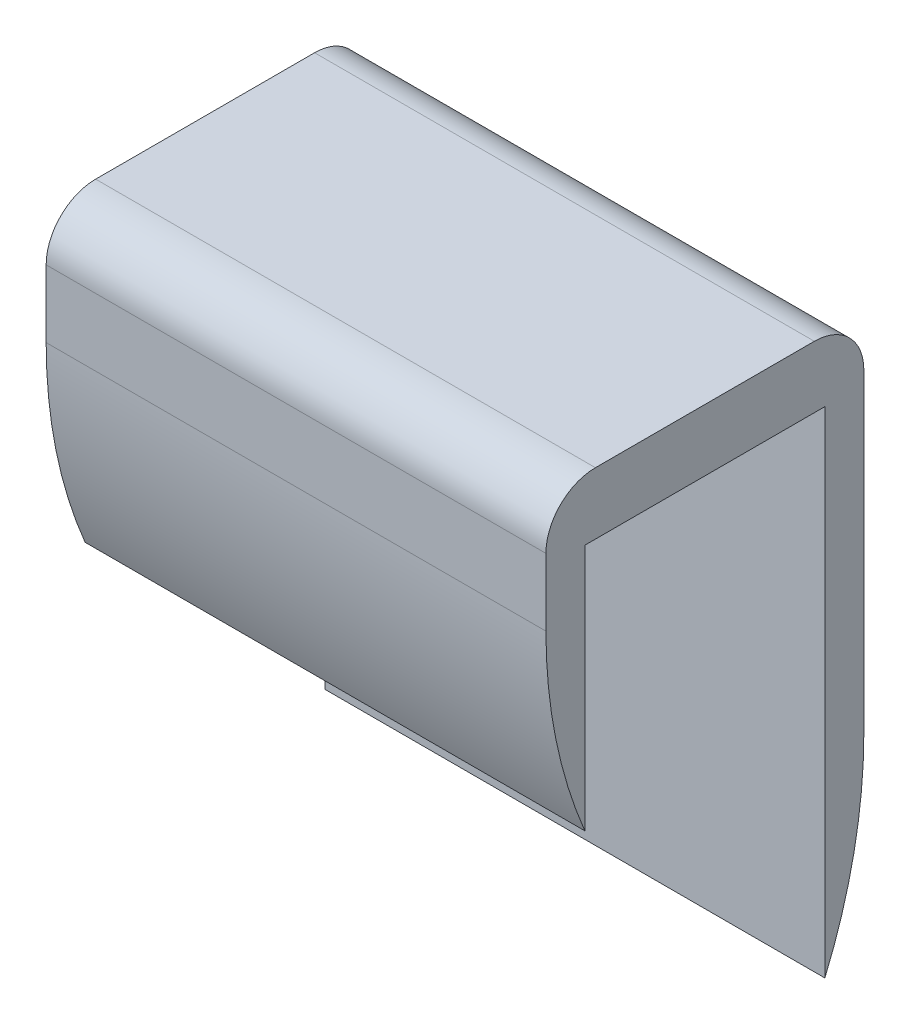
ISO-10303-21;
HEADER;
FILE_DESCRIPTION(('STEP AP214'),'2;1');
FILE_NAME('part.step','',(''),(''),'','','');
FILE_SCHEMA(('AUTOMOTIVE_DESIGN { 1 0 10303 214 1 1 1 1 }'));
ENDSEC;
DATA;
#1=APPLICATION_CONTEXT('core data for automotive mechanical design processes');
#2=APPLICATION_PROTOCOL_DEFINITION('international standard','automotive_design',2000,#1);
#3=PRODUCT_CONTEXT('',#1,'mechanical');
#4=PRODUCT('Part','Part','',(#3));
#5=PRODUCT_RELATED_PRODUCT_CATEGORY('part','',(#4));
#6=PRODUCT_DEFINITION_FORMATION('','',#4);
#7=PRODUCT_DEFINITION_CONTEXT('part definition',#1,'design');
#8=PRODUCT_DEFINITION('design','',#6,#7);
#9=PRODUCT_DEFINITION_SHAPE('','',#8);
#10=(LENGTH_UNIT() NAMED_UNIT(*) SI_UNIT(.MILLI.,.METRE.));
#11=(NAMED_UNIT(*) PLANE_ANGLE_UNIT() SI_UNIT($,.RADIAN.));
#12=(NAMED_UNIT(*) SI_UNIT($,.STERADIAN.) SOLID_ANGLE_UNIT());
#13=UNCERTAINTY_MEASURE_WITH_UNIT(LENGTH_MEASURE(1.E-05),#10,'distance_accuracy_value','');
#14=(GEOMETRIC_REPRESENTATION_CONTEXT(3) GLOBAL_UNCERTAINTY_ASSIGNED_CONTEXT((#13)) GLOBAL_UNIT_ASSIGNED_CONTEXT((#10,
#11,#12)) REPRESENTATION_CONTEXT('',''));
#15=CARTESIAN_POINT('',(0.,0.,0.));
#16=DIRECTION('',(0.,0.,1.));
#17=DIRECTION('',(1.,0.,0.));
#18=AXIS2_PLACEMENT_3D('',#15,#16,#17);
#19=CARTESIAN_POINT('',(25.654,3.175,8.1595));
#20=DIRECTION('',(0.,0.,-1.));
#21=DIRECTION('',(0.,1.,0.));
#22=AXIS2_PLACEMENT_3D('',#19,#20,#21);
#23=PLANE('',#22);
#24=DIRECTION('',(0.,-1.,0.));
#25=VECTOR('',#24,1.);
#26=CARTESIAN_POINT('',(25.654,3.175,8.1595));
#27=LINE('',#26,#25);
#28=CARTESIAN_POINT('',(25.654,0.634999999999998,8.1595));
#29=VERTEX_POINT('',#28);
#30=CARTESIAN_POINT('',(25.654,-2.82072877181723,8.1595));
#31=VERTEX_POINT('',#30);
#32=EDGE_CURVE('E116',#29,#31,#27,.T.);
#33=ORIENTED_EDGE('',*,*,#32,.F.);
#34=DIRECTION('',(-1.,0.,0.));
#35=VECTOR('',#34,1.);
#36=CARTESIAN_POINT('',(25.654,0.634999999999998,8.1595));
#37=LINE('',#36,#35);
#38=CARTESIAN_POINT('',(0.,0.634999999999998,8.1595));
#39=VERTEX_POINT('',#38);
#40=EDGE_CURVE('E11',#29,#39,#37,.T.);
#41=ORIENTED_EDGE('',*,*,#40,.T.);
#42=DIRECTION('',(0.,-1.,0.));
#43=VECTOR('',#42,1.);
#44=CARTESIAN_POINT('',(0.,3.175,8.1595));
#45=LINE('',#44,#43);
#46=CARTESIAN_POINT('',(0.,-2.82072877181723,8.1595));
#47=VERTEX_POINT('',#46);
#48=EDGE_CURVE('E207',#39,#47,#45,.T.);
#49=ORIENTED_EDGE('',*,*,#48,.T.);
#50=DIRECTION('',(1.,0.,0.));
#51=VECTOR('',#50,1.);
#52=CARTESIAN_POINT('',(25.654,-2.82072877181723,8.1595));
#53=LINE('',#52,#51);
#54=EDGE_CURVE('E145',#47,#31,#53,.T.);
#55=ORIENTED_EDGE('',*,*,#54,.T.);
#56=EDGE_LOOP('',(#33,#41,#49,#55));
#57=FACE_BOUND('',#56,.T.);
#58=ADVANCED_FACE('F33',(#57),#23,.F.);
#59=CARTESIAN_POINT('',(25.654,-12.7,6.1595));
#60=DIRECTION('',(0.,0.,1.));
#61=DIRECTION('',(1.,0.,0.));
#62=AXIS2_PLACEMENT_3D('',#59,#60,#61);
#63=PLANE('',#62);
#64=DIRECTION('',(0.,1.,0.));
#65=VECTOR('',#64,1.);
#66=CARTESIAN_POINT('',(0.,-12.7,6.1595));
#67=LINE('',#66,#65);
#68=CARTESIAN_POINT('',(0.,-12.7,6.1595));
#69=VERTEX_POINT('',#68);
#70=CARTESIAN_POINT('',(0.,0.,6.1595));
#71=VERTEX_POINT('',#70);
#72=EDGE_CURVE('E209',#69,#71,#67,.T.);
#73=ORIENTED_EDGE('',*,*,#72,.T.);
#74=DIRECTION('',(-1.,0.,0.));
#75=VECTOR('',#74,1.);
#76=CARTESIAN_POINT('',(25.654,0.,6.1595));
#77=LINE('',#76,#75);
#78=CARTESIAN_POINT('',(25.654,0.,6.1595));
#79=VERTEX_POINT('',#78);
#80=EDGE_CURVE('E130',#79,#71,#77,.T.);
#81=ORIENTED_EDGE('',*,*,#80,.F.);
#82=DIRECTION('',(0.,1.,0.));
#83=VECTOR('',#82,1.);
#84=CARTESIAN_POINT('',(25.654,-12.7,6.1595));
#85=LINE('',#84,#83);
#86=CARTESIAN_POINT('',(25.654,-12.7,6.1595));
#87=VERTEX_POINT('',#86);
#88=EDGE_CURVE('E114',#87,#79,#85,.T.);
#89=ORIENTED_EDGE('',*,*,#88,.F.);
#90=DIRECTION('',(-1.,0.,0.));
#91=VECTOR('',#90,1.);
#92=CARTESIAN_POINT('',(25.654,-12.7,6.1595));
#93=LINE('',#92,#91);
#94=EDGE_CURVE('E127',#87,#69,#93,.T.);
#95=ORIENTED_EDGE('',*,*,#94,.T.);
#96=EDGE_LOOP('',(#73,#81,#89,#95));
#97=FACE_BOUND('',#96,.T.);
#98=ADVANCED_FACE('F126',(#97),#63,.F.);
#99=CARTESIAN_POINT('',(25.654,0.,6.1595));
#100=DIRECTION('',(0.,1.,0.));
#101=DIRECTION('',(0.,0.,1.));
#102=AXIS2_PLACEMENT_3D('',#99,#100,#101);
#103=PLANE('',#102);
#104=DIRECTION('',(0.,0.,-1.));
#105=VECTOR('',#104,1.);
#106=CARTESIAN_POINT('',(0.,0.,6.1595));
#107=LINE('',#106,#105);
#108=CARTESIAN_POINT('',(0.,0.,-6.1595));
#109=VERTEX_POINT('',#108);
#110=EDGE_CURVE('E185',#71,#109,#107,.T.);
#111=ORIENTED_EDGE('',*,*,#110,.T.);
#112=DIRECTION('',(-1.,0.,0.));
#113=VECTOR('',#112,1.);
#114=CARTESIAN_POINT('',(25.654,0.,-6.1595));
#115=LINE('',#114,#113);
#116=CARTESIAN_POINT('',(25.654,0.,-6.1595));
#117=VERTEX_POINT('',#116);
#118=EDGE_CURVE('E140',#117,#109,#115,.T.);
#119=ORIENTED_EDGE('',*,*,#118,.F.);
#120=DIRECTION('',(0.,0.,-1.));
#121=VECTOR('',#120,1.);
#122=CARTESIAN_POINT('',(25.654,0.,6.1595));
#123=LINE('',#122,#121);
#124=EDGE_CURVE('E132',#79,#117,#123,.T.);
#125=ORIENTED_EDGE('',*,*,#124,.F.);
#126=ORIENTED_EDGE('',*,*,#80,.T.);
#127=EDGE_LOOP('',(#111,#119,#125,#126));
#128=FACE_BOUND('',#127,.T.);
#129=ADVANCED_FACE('F210',(#128),#103,.F.);
#130=CARTESIAN_POINT('',(25.654,0.,-6.1595));
#131=DIRECTION('',(0.,0.,-1.));
#132=DIRECTION('',(0.,1.,0.));
#133=AXIS2_PLACEMENT_3D('',#130,#131,#132);
#134=PLANE('',#133);
#135=DIRECTION('',(0.,-1.,0.));
#136=VECTOR('',#135,1.);
#137=CARTESIAN_POINT('',(0.,0.,-6.1595));
#138=LINE('',#137,#136);
#139=CARTESIAN_POINT('',(0.,-25.4,-6.15950000000001));
#140=VERTEX_POINT('',#139);
#141=EDGE_CURVE('E181',#109,#140,#138,.T.);
#142=ORIENTED_EDGE('',*,*,#141,.T.);
#143=DIRECTION('',(-1.,0.,0.));
#144=VECTOR('',#143,1.);
#145=CARTESIAN_POINT('',(25.654,-25.4,-6.15950000000001));
#146=LINE('',#145,#144);
#147=CARTESIAN_POINT('',(25.654,-25.4,-6.15950000000001));
#148=VERTEX_POINT('',#147);
#149=EDGE_CURVE('E171',#148,#140,#146,.T.);
#150=ORIENTED_EDGE('',*,*,#149,.F.);
#151=DIRECTION('',(0.,-1.,0.));
#152=VECTOR('',#151,1.);
#153=CARTESIAN_POINT('',(25.654,0.,-6.1595));
#154=LINE('',#153,#152);
#155=EDGE_CURVE('E197',#117,#148,#154,.T.);
#156=ORIENTED_EDGE('',*,*,#155,.F.);
#157=ORIENTED_EDGE('',*,*,#118,.T.);
#158=EDGE_LOOP('',(#142,#150,#156,#157));
#159=FACE_BOUND('',#158,.T.);
#160=ADVANCED_FACE('F195',(#159),#134,.F.);
#161=CARTESIAN_POINT('',(25.654,-25.4,-8.15950000000001));
#162=DIRECTION('',(0.,0.,1.));
#163=DIRECTION('',(1.,0.,0.));
#164=AXIS2_PLACEMENT_3D('',#161,#162,#163);
#165=PLANE('',#164);
#166=DIRECTION('',(0.,1.,0.));
#167=VECTOR('',#166,1.);
#168=CARTESIAN_POINT('',(0.,-25.4,-8.15950000000001));
#169=LINE('',#168,#167);
#170=CARTESIAN_POINT('',(0.,-15.5207287718172,-8.15950000000001));
#171=VERTEX_POINT('',#170);
#172=CARTESIAN_POINT('',(0.,0.635,-8.15950000000001));
#173=VERTEX_POINT('',#172);
#174=EDGE_CURVE('E177',#171,#173,#169,.T.);
#175=ORIENTED_EDGE('',*,*,#174,.T.);
#176=DIRECTION('',(-1.,0.,0.));
#177=VECTOR('',#176,1.);
#178=CARTESIAN_POINT('',(25.654,0.635,-8.15950000000001));
#179=LINE('',#178,#177);
#180=CARTESIAN_POINT('',(25.654,0.635,-8.15950000000001));
#181=VERTEX_POINT('',#180);
#182=EDGE_CURVE('E56',#173,#181,#179,.F.);
#183=ORIENTED_EDGE('',*,*,#182,.T.);
#184=DIRECTION('',(0.,1.,0.));
#185=VECTOR('',#184,1.);
#186=CARTESIAN_POINT('',(25.654,-25.4,-8.15950000000001));
#187=LINE('',#186,#185);
#188=CARTESIAN_POINT('',(25.654,-15.5207287718172,-8.15950000000001));
#189=VERTEX_POINT('',#188);
#190=EDGE_CURVE('E163',#189,#181,#187,.T.);
#191=ORIENTED_EDGE('',*,*,#190,.F.);
#192=DIRECTION('',(-1.,0.,0.));
#193=VECTOR('',#192,1.);
#194=CARTESIAN_POINT('',(25.654,-15.5207287718172,-8.15950000000001));
#195=LINE('',#194,#193);
#196=EDGE_CURVE('E121',#189,#171,#195,.T.);
#197=ORIENTED_EDGE('',*,*,#196,.T.);
#198=EDGE_LOOP('',(#175,#183,#191,#197));
#199=FACE_BOUND('',#198,.T.);
#200=ADVANCED_FACE('F179',(#199),#165,.F.);
#201=CARTESIAN_POINT('',(25.654,3.175,-8.15950000000001));
#202=DIRECTION('',(0.,-1.,0.));
#203=DIRECTION('',(0.,0.,-1.));
#204=AXIS2_PLACEMENT_3D('',#201,#202,#203);
#205=PLANE('',#204);
#206=DIRECTION('',(0.,0.,1.));
#207=VECTOR('',#206,1.);
#208=CARTESIAN_POINT('',(25.654,3.175,-8.15950000000001));
#209=LINE('',#208,#207);
#210=CARTESIAN_POINT('',(25.654,3.175,-5.61950000000001));
#211=VERTEX_POINT('',#210);
#212=CARTESIAN_POINT('',(25.654,3.175,5.6195));
#213=VERTEX_POINT('',#212);
#214=EDGE_CURVE('E162',#211,#213,#209,.T.);
#215=ORIENTED_EDGE('',*,*,#214,.F.);
#216=DIRECTION('',(-1.,0.,0.));
#217=VECTOR('',#216,1.);
#218=CARTESIAN_POINT('',(25.654,3.175,-5.61950000000001));
#219=LINE('',#218,#217);
#220=CARTESIAN_POINT('',(0.,3.175,-5.61950000000001));
#221=VERTEX_POINT('',#220);
#222=EDGE_CURVE('E152',#211,#221,#219,.T.);
#223=ORIENTED_EDGE('',*,*,#222,.T.);
#224=DIRECTION('',(0.,0.,1.));
#225=VECTOR('',#224,1.);
#226=CARTESIAN_POINT('',(0.,3.175,-8.15950000000001));
#227=LINE('',#226,#225);
#228=CARTESIAN_POINT('',(0.,3.175,5.6195));
#229=VERTEX_POINT('',#228);
#230=EDGE_CURVE('E178',#221,#229,#227,.T.);
#231=ORIENTED_EDGE('',*,*,#230,.T.);
#232=DIRECTION('',(-1.,0.,0.));
#233=VECTOR('',#232,1.);
#234=CARTESIAN_POINT('',(25.654,3.175,5.6195));
#235=LINE('',#234,#233);
#236=EDGE_CURVE('E150',#229,#213,#235,.F.);
#237=ORIENTED_EDGE('',*,*,#236,.T.);
#238=EDGE_LOOP('',(#215,#223,#231,#237));
#239=FACE_BOUND('',#238,.T.);
#240=ADVANCED_FACE('F167',(#239),#205,.F.);
#241=CARTESIAN_POINT('',(25.654,0.,0.));
#242=DIRECTION('',(1.,0.,0.));
#243=DIRECTION('',(0.,0.,-1.));
#244=AXIS2_PLACEMENT_3D('',#241,#242,#243);
#245=PLANE('',#244);
#246=ORIENTED_EDGE('',*,*,#190,.T.);
#247=CARTESIAN_POINT('',(25.654,0.635,-5.61950000000001));
#248=DIRECTION('',(1.,0.,0.));
#249=DIRECTION('',(0.,0.,-1.));
#250=AXIS2_PLACEMENT_3D('',#247,#248,#249);
#251=CIRCLE('',#250,2.54);
#252=EDGE_CURVE('E41',#181,#211,#251,.T.);
#253=ORIENTED_EDGE('',*,*,#252,.T.);
#254=ORIENTED_EDGE('',*,*,#214,.T.);
#255=CARTESIAN_POINT('',(25.654,0.634999999999998,5.6195));
#256=DIRECTION('',(1.,0.,0.));
#257=DIRECTION('',(0.,0.,-1.));
#258=AXIS2_PLACEMENT_3D('',#255,#256,#257);
#259=CIRCLE('',#258,2.54);
#260=EDGE_CURVE('E48',#213,#29,#259,.T.);
#261=ORIENTED_EDGE('',*,*,#260,.T.);
#262=ORIENTED_EDGE('',*,*,#32,.T.);
#263=CARTESIAN_POINT('',(25.654,-2.82072877181722,-17.2405));
#264=DIRECTION('',(1.,0.,0.));
#265=DIRECTION('',(0.,0.,-1.));
#266=AXIS2_PLACEMENT_3D('',#263,#264,#265);
#267=CIRCLE('',#266,25.4);
#268=EDGE_CURVE('E111',#31,#87,#267,.T.);
#269=ORIENTED_EDGE('',*,*,#268,.T.);
#270=ORIENTED_EDGE('',*,*,#88,.T.);
#271=ORIENTED_EDGE('',*,*,#124,.T.);
#272=ORIENTED_EDGE('',*,*,#155,.T.);
#273=CARTESIAN_POINT('',(25.654,-15.5207287718172,17.2405));
#274=DIRECTION('',(1.,0.,0.));
#275=DIRECTION('',(0.,0.,-1.));
#276=AXIS2_PLACEMENT_3D('',#273,#274,#275);
#277=CIRCLE('',#276,25.4);
#278=EDGE_CURVE('E122',#148,#189,#277,.T.);
#279=ORIENTED_EDGE('',*,*,#278,.T.);
#280=EDGE_LOOP('',(#246,#253,#254,#261,#262,#269,#270,#271,#272,#279));
#281=FACE_BOUND('',#280,.T.);
#282=ADVANCED_FACE('F113',(#281),#245,.T.);
#283=CARTESIAN_POINT('',(0.,0.,0.));
#284=DIRECTION('',(1.,0.,0.));
#285=DIRECTION('',(0.,0.,-1.));
#286=AXIS2_PLACEMENT_3D('',#283,#284,#285);
#287=PLANE('',#286);
#288=ORIENTED_EDGE('',*,*,#230,.F.);
#289=CARTESIAN_POINT('',(0.,0.635,-5.61950000000001));
#290=DIRECTION('',(1.,0.,0.));
#291=DIRECTION('',(0.,0.,-1.));
#292=AXIS2_PLACEMENT_3D('',#289,#290,#291);
#293=CIRCLE('',#292,2.54);
#294=EDGE_CURVE('E157',#221,#173,#293,.F.);
#295=ORIENTED_EDGE('',*,*,#294,.T.);
#296=ORIENTED_EDGE('',*,*,#174,.F.);
#297=CARTESIAN_POINT('',(0.,-15.5207287718172,17.2405));
#298=DIRECTION('',(1.,0.,0.));
#299=DIRECTION('',(0.,0.,-1.));
#300=AXIS2_PLACEMENT_3D('',#297,#298,#299);
#301=CIRCLE('',#300,25.4);
#302=EDGE_CURVE('E137',#171,#140,#301,.F.);
#303=ORIENTED_EDGE('',*,*,#302,.T.);
#304=ORIENTED_EDGE('',*,*,#141,.F.);
#305=ORIENTED_EDGE('',*,*,#110,.F.);
#306=ORIENTED_EDGE('',*,*,#72,.F.);
#307=CARTESIAN_POINT('',(0.,-2.82072877181722,-17.2405));
#308=DIRECTION('',(1.,0.,0.));
#309=DIRECTION('',(0.,0.,-1.));
#310=AXIS2_PLACEMENT_3D('',#307,#308,#309);
#311=CIRCLE('',#310,25.4);
#312=EDGE_CURVE('E136',#69,#47,#311,.F.);
#313=ORIENTED_EDGE('',*,*,#312,.T.);
#314=ORIENTED_EDGE('',*,*,#48,.F.);
#315=CARTESIAN_POINT('',(0.,0.634999999999998,5.6195));
#316=DIRECTION('',(1.,0.,0.));
#317=DIRECTION('',(0.,0.,-1.));
#318=AXIS2_PLACEMENT_3D('',#315,#316,#317);
#319=CIRCLE('',#318,2.54);
#320=EDGE_CURVE('E155',#39,#229,#319,.F.);
#321=ORIENTED_EDGE('',*,*,#320,.T.);
#322=EDGE_LOOP('',(#288,#295,#296,#303,#304,#305,#306,#313,#314,#321));
#323=FACE_BOUND('',#322,.T.);
#324=ADVANCED_FACE('F176',(#323),#287,.F.);
#325=CARTESIAN_POINT('',(25.654,-2.82072877181722,-17.2405));
#326=DIRECTION('',(1.,0.,0.));
#327=DIRECTION('',(0.,0.,-1.));
#328=AXIS2_PLACEMENT_3D('',#325,#326,#327);
#329=CYLINDRICAL_SURFACE('',#328,25.4);
#330=ORIENTED_EDGE('',*,*,#268,.F.);
#331=ORIENTED_EDGE('',*,*,#54,.F.);
#332=ORIENTED_EDGE('',*,*,#312,.F.);
#333=ORIENTED_EDGE('',*,*,#94,.F.);
#334=EDGE_LOOP('',(#330,#331,#332,#333));
#335=FACE_BOUND('',#334,.T.);
#336=ADVANCED_FACE('F134',(#335),#329,.T.);
#337=CARTESIAN_POINT('',(25.654,-15.5207287718172,17.2405));
#338=DIRECTION('',(-1.,0.,0.));
#339=DIRECTION('',(0.,0.,1.));
#340=AXIS2_PLACEMENT_3D('',#337,#338,#339);
#341=CYLINDRICAL_SURFACE('',#340,25.4);
#342=ORIENTED_EDGE('',*,*,#278,.F.);
#343=ORIENTED_EDGE('',*,*,#149,.T.);
#344=ORIENTED_EDGE('',*,*,#302,.F.);
#345=ORIENTED_EDGE('',*,*,#196,.F.);
#346=EDGE_LOOP('',(#342,#343,#344,#345));
#347=FACE_BOUND('',#346,.T.);
#348=ADVANCED_FACE('F202',(#347),#341,.T.);
#349=CARTESIAN_POINT('',(25.654,0.635,-5.61950000000001));
#350=DIRECTION('',(-1.,0.,0.));
#351=DIRECTION('',(0.,0.,1.));
#352=AXIS2_PLACEMENT_3D('',#349,#350,#351);
#353=CYLINDRICAL_SURFACE('',#352,2.54);
#354=ORIENTED_EDGE('',*,*,#252,.F.);
#355=ORIENTED_EDGE('',*,*,#182,.F.);
#356=ORIENTED_EDGE('',*,*,#294,.F.);
#357=ORIENTED_EDGE('',*,*,#222,.F.);
#358=EDGE_LOOP('',(#354,#355,#356,#357));
#359=FACE_BOUND('',#358,.T.);
#360=ADVANCED_FACE('F173',(#359),#353,.T.);
#361=CARTESIAN_POINT('',(25.654,0.634999999999998,5.6195));
#362=DIRECTION('',(-1.,0.,0.));
#363=DIRECTION('',(0.,0.,1.));
#364=AXIS2_PLACEMENT_3D('',#361,#362,#363);
#365=CYLINDRICAL_SURFACE('',#364,2.54);
#366=ORIENTED_EDGE('',*,*,#260,.F.);
#367=ORIENTED_EDGE('',*,*,#236,.F.);
#368=ORIENTED_EDGE('',*,*,#320,.F.);
#369=ORIENTED_EDGE('',*,*,#40,.F.);
#370=EDGE_LOOP('',(#366,#367,#368,#369));
#371=FACE_BOUND('',#370,.T.);
#372=ADVANCED_FACE('F35',(#371),#365,.T.);
#373=CLOSED_SHELL('',(#58,#98,#129,#160,#200,#240,#282,#324,#336,#348,#360,#372));
#374=MANIFOLD_SOLID_BREP('B2',#373);
#375=ADVANCED_BREP_SHAPE_REPRESENTATION('',(#18,#374),#14);
#376=SHAPE_DEFINITION_REPRESENTATION(#9,#375);
ENDSEC;
END-ISO-10303-21;
